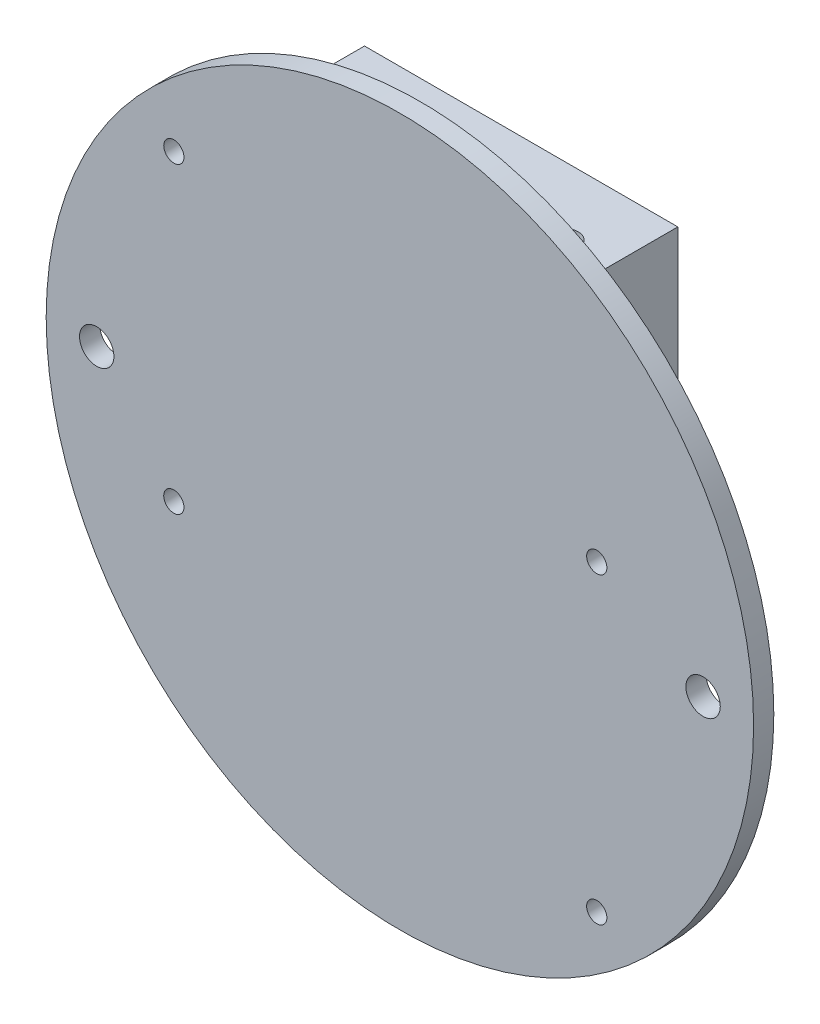
ISO-10303-21;
HEADER;
FILE_DESCRIPTION(('STEP AP214'),'2;1');
FILE_NAME('part.step','',(''),(''),'','','');
FILE_SCHEMA(('AUTOMOTIVE_DESIGN { 1 0 10303 214 1 1 1 1 }'));
ENDSEC;
DATA;
#1=APPLICATION_CONTEXT('core data for automotive mechanical design processes');
#2=APPLICATION_PROTOCOL_DEFINITION('international standard','automotive_design',2000,#1);
#3=PRODUCT_CONTEXT('',#1,'mechanical');
#4=PRODUCT('Part','Part','',(#3));
#5=PRODUCT_RELATED_PRODUCT_CATEGORY('part','',(#4));
#6=PRODUCT_DEFINITION_FORMATION('','',#4);
#7=PRODUCT_DEFINITION_CONTEXT('part definition',#1,'design');
#8=PRODUCT_DEFINITION('design','',#6,#7);
#9=PRODUCT_DEFINITION_SHAPE('','',#8);
#10=(LENGTH_UNIT() NAMED_UNIT(*) SI_UNIT(.MILLI.,.METRE.));
#11=(NAMED_UNIT(*) PLANE_ANGLE_UNIT() SI_UNIT($,.RADIAN.));
#12=(NAMED_UNIT(*) SI_UNIT($,.STERADIAN.) SOLID_ANGLE_UNIT());
#13=UNCERTAINTY_MEASURE_WITH_UNIT(LENGTH_MEASURE(1.E-05),#10,'distance_accuracy_value','');
#14=(GEOMETRIC_REPRESENTATION_CONTEXT(3) GLOBAL_UNCERTAINTY_ASSIGNED_CONTEXT((#13)) GLOBAL_UNIT_ASSIGNED_CONTEXT((#10,
#11,#12)) REPRESENTATION_CONTEXT('',''));
#15=CARTESIAN_POINT('',(0.,0.,0.));
#16=DIRECTION('',(0.,0.,1.));
#17=DIRECTION('',(1.,0.,0.));
#18=AXIS2_PLACEMENT_3D('',#15,#16,#17);
#19=CARTESIAN_POINT('',(0.,0.,0.));
#20=DIRECTION('',(0.,0.,1.));
#21=DIRECTION('',(1.,0.,0.));
#22=AXIS2_PLACEMENT_3D('',#19,#20,#21);
#23=PLANE('',#22);
#24=CARTESIAN_POINT('',(30.,0.,0.));
#25=DIRECTION('',(0.,0.,1.));
#26=DIRECTION('',(1.,0.,0.));
#27=AXIS2_PLACEMENT_3D('',#24,#25,#26);
#28=CIRCLE('',#27,1.7);
#29=CARTESIAN_POINT('',(31.7,0.,0.));
#30=VERTEX_POINT('',#29);
#31=EDGE_CURVE('E215',#30,#30,#28,.T.);
#32=ORIENTED_EDGE('',*,*,#31,.T.);
#33=EDGE_LOOP('',(#32));
#34=FACE_BOUND('',#33,.T.);
#35=CARTESIAN_POINT('',(-30.,0.,0.));
#36=DIRECTION('',(0.,0.,1.));
#37=DIRECTION('',(1.,0.,0.));
#38=AXIS2_PLACEMENT_3D('',#35,#36,#37);
#39=CIRCLE('',#38,1.7);
#40=CARTESIAN_POINT('',(-28.3,0.,0.));
#41=VERTEX_POINT('',#40);
#42=EDGE_CURVE('E525',#41,#41,#39,.T.);
#43=ORIENTED_EDGE('',*,*,#42,.T.);
#44=EDGE_LOOP('',(#43));
#45=FACE_BOUND('',#44,.T.);
#46=CARTESIAN_POINT('',(-22.3667772034413,20.53,0.));
#47=DIRECTION('',(0.,0.,-1.));
#48=DIRECTION('',(-1.,0.,0.));
#49=AXIS2_PLACEMENT_3D('',#46,#47,#48);
#50=CIRCLE('',#49,1.);
#51=CARTESIAN_POINT('',(-23.3667772034413,20.53,0.));
#52=VERTEX_POINT('',#51);
#53=EDGE_CURVE('E187',#52,#52,#50,.T.);
#54=ORIENTED_EDGE('',*,*,#53,.F.);
#55=EDGE_LOOP('',(#54));
#56=FACE_BOUND('',#55,.T.);
#57=CARTESIAN_POINT('',(-22.37,-9.46999982689304,0.));
#58=DIRECTION('',(0.,0.,-1.));
#59=DIRECTION('',(-1.,0.,0.));
#60=AXIS2_PLACEMENT_3D('',#57,#58,#59);
#61=CIRCLE('',#60,1.);
#62=CARTESIAN_POINT('',(-23.37,-9.46999982689304,0.));
#63=VERTEX_POINT('',#62);
#64=EDGE_CURVE('E224',#63,#63,#61,.T.);
#65=ORIENTED_EDGE('',*,*,#64,.F.);
#66=EDGE_LOOP('',(#65));
#67=FACE_BOUND('',#66,.T.);
#68=CARTESIAN_POINT('',(19.48,6.28,0.));
#69=DIRECTION('',(0.,0.,-1.));
#70=DIRECTION('',(-1.,0.,0.));
#71=AXIS2_PLACEMENT_3D('',#68,#69,#70);
#72=CIRCLE('',#71,1.);
#73=CARTESIAN_POINT('',(18.48,6.28,0.));
#74=VERTEX_POINT('',#73);
#75=EDGE_CURVE('E227',#74,#74,#72,.T.);
#76=ORIENTED_EDGE('',*,*,#75,.F.);
#77=EDGE_LOOP('',(#76));
#78=FACE_BOUND('',#77,.T.);
#79=CARTESIAN_POINT('',(19.48,-23.72,0.));
#80=DIRECTION('',(0.,0.,-1.));
#81=DIRECTION('',(-1.,0.,0.));
#82=AXIS2_PLACEMENT_3D('',#79,#80,#81);
#83=CIRCLE('',#82,1.);
#84=CARTESIAN_POINT('',(18.48,-23.72,0.));
#85=VERTEX_POINT('',#84);
#86=EDGE_CURVE('E221',#85,#85,#83,.T.);
#87=ORIENTED_EDGE('',*,*,#86,.F.);
#88=EDGE_LOOP('',(#87));
#89=FACE_BOUND('',#88,.T.);
#90=CARTESIAN_POINT('',(0.,0.,0.));
#91=DIRECTION('',(0.,0.,1.));
#92=DIRECTION('',(1.,0.,0.));
#93=AXIS2_PLACEMENT_3D('',#90,#91,#92);
#94=CIRCLE('',#93,35.);
#95=CARTESIAN_POINT('',(35.,0.,0.));
#96=VERTEX_POINT('',#95);
#97=EDGE_CURVE('E53',#96,#96,#94,.T.);
#98=ORIENTED_EDGE('',*,*,#97,.F.);
#99=EDGE_LOOP('',(#98));
#100=FACE_BOUND('',#99,.T.);
#101=DIRECTION('',(-1.,0.,0.));
#102=VECTOR('',#101,1.);
#103=CARTESIAN_POINT('',(15.5,-9.5,0.));
#104=LINE('',#103,#102);
#105=CARTESIAN_POINT('',(15.5,-9.5,0.));
#106=VERTEX_POINT('',#105);
#107=CARTESIAN_POINT('',(-15.5,-9.49999999999999,0.));
#108=VERTEX_POINT('',#107);
#109=EDGE_CURVE('E128',#106,#108,#104,.T.);
#110=ORIENTED_EDGE('',*,*,#109,.F.);
#111=DIRECTION('',(0.,-1.,0.));
#112=VECTOR('',#111,1.);
#113=CARTESIAN_POINT('',(15.5,27.,0.));
#114=LINE('',#113,#112);
#115=CARTESIAN_POINT('',(15.5,27.,0.));
#116=VERTEX_POINT('',#115);
#117=EDGE_CURVE('E158',#116,#106,#114,.T.);
#118=ORIENTED_EDGE('',*,*,#117,.F.);
#119=DIRECTION('',(1.,0.,0.));
#120=VECTOR('',#119,1.);
#121=CARTESIAN_POINT('',(-15.5,27.,0.));
#122=LINE('',#121,#120);
#123=CARTESIAN_POINT('',(-15.5,27.,0.));
#124=VERTEX_POINT('',#123);
#125=EDGE_CURVE('E66',#124,#116,#122,.T.);
#126=ORIENTED_EDGE('',*,*,#125,.F.);
#127=DIRECTION('',(0.,1.,0.));
#128=VECTOR('',#127,1.);
#129=CARTESIAN_POINT('',(-15.5,-9.49999999999999,0.));
#130=LINE('',#129,#128);
#131=EDGE_CURVE('E61',#108,#124,#130,.T.);
#132=ORIENTED_EDGE('',*,*,#131,.F.);
#133=EDGE_LOOP('',(#110,#118,#126,#132));
#134=FACE_BOUND('',#133,.T.);
#135=ADVANCED_FACE('F44',(#34,#45,#56,#67,#78,#89,#100,#134),#23,.F.);
#136=CARTESIAN_POINT('',(0.,0.,2.));
#137=DIRECTION('',(0.,0.,-1.));
#138=DIRECTION('',(-1.,0.,0.));
#139=AXIS2_PLACEMENT_3D('',#136,#137,#138);
#140=CYLINDRICAL_SURFACE('',#139,35.);
#141=CARTESIAN_POINT('',(0.,0.,2.));
#142=DIRECTION('',(0.,0.,1.));
#143=DIRECTION('',(1.,0.,0.));
#144=AXIS2_PLACEMENT_3D('',#141,#142,#143);
#145=CIRCLE('',#144,35.);
#146=CARTESIAN_POINT('',(35.,0.,2.));
#147=VERTEX_POINT('',#146);
#148=EDGE_CURVE('E11',#147,#147,#145,.T.);
#149=ORIENTED_EDGE('',*,*,#148,.F.);
#150=EDGE_LOOP('',(#149));
#151=FACE_BOUND('',#150,.T.);
#152=ORIENTED_EDGE('',*,*,#97,.T.);
#153=EDGE_LOOP('',(#152));
#154=FACE_BOUND('',#153,.T.);
#155=ADVANCED_FACE('F46',(#151,#154),#140,.T.);
#156=CARTESIAN_POINT('',(0.,0.,2.));
#157=DIRECTION('',(0.,0.,1.));
#158=DIRECTION('',(1.,0.,0.));
#159=AXIS2_PLACEMENT_3D('',#156,#157,#158);
#160=PLANE('',#159);
#161=CARTESIAN_POINT('',(30.,0.,2.));
#162=DIRECTION('',(0.,0.,1.));
#163=DIRECTION('',(1.,0.,0.));
#164=AXIS2_PLACEMENT_3D('',#161,#162,#163);
#165=CIRCLE('',#164,1.7);
#166=CARTESIAN_POINT('',(31.7,0.,2.));
#167=VERTEX_POINT('',#166);
#168=EDGE_CURVE('E522',#167,#167,#165,.T.);
#169=ORIENTED_EDGE('',*,*,#168,.F.);
#170=EDGE_LOOP('',(#169));
#171=FACE_BOUND('',#170,.T.);
#172=CARTESIAN_POINT('',(-30.,0.,2.));
#173=DIRECTION('',(0.,0.,1.));
#174=DIRECTION('',(1.,0.,0.));
#175=AXIS2_PLACEMENT_3D('',#172,#173,#174);
#176=CIRCLE('',#175,1.7);
#177=CARTESIAN_POINT('',(-28.3,0.,2.));
#178=VERTEX_POINT('',#177);
#179=EDGE_CURVE('E529',#178,#178,#176,.T.);
#180=ORIENTED_EDGE('',*,*,#179,.F.);
#181=EDGE_LOOP('',(#180));
#182=FACE_BOUND('',#181,.T.);
#183=CARTESIAN_POINT('',(-22.3667772034413,20.53,2.));
#184=DIRECTION('',(0.,0.,1.));
#185=DIRECTION('',(1.,0.,0.));
#186=AXIS2_PLACEMENT_3D('',#183,#184,#185);
#187=CIRCLE('',#186,1.);
#188=CARTESIAN_POINT('',(-21.3667772034413,20.53,2.));
#189=VERTEX_POINT('',#188);
#190=EDGE_CURVE('E143',#189,#189,#187,.T.);
#191=ORIENTED_EDGE('',*,*,#190,.F.);
#192=EDGE_LOOP('',(#191));
#193=FACE_BOUND('',#192,.T.);
#194=CARTESIAN_POINT('',(-22.37,-9.46999982689304,2.));
#195=DIRECTION('',(0.,0.,1.));
#196=DIRECTION('',(1.,0.,0.));
#197=AXIS2_PLACEMENT_3D('',#194,#195,#196);
#198=CIRCLE('',#197,1.);
#199=CARTESIAN_POINT('',(-21.37,-9.46999982689304,2.));
#200=VERTEX_POINT('',#199);
#201=EDGE_CURVE('E190',#200,#200,#198,.T.);
#202=ORIENTED_EDGE('',*,*,#201,.F.);
#203=EDGE_LOOP('',(#202));
#204=FACE_BOUND('',#203,.T.);
#205=CARTESIAN_POINT('',(19.48,6.28,2.));
#206=DIRECTION('',(0.,0.,1.));
#207=DIRECTION('',(1.,0.,0.));
#208=AXIS2_PLACEMENT_3D('',#205,#206,#207);
#209=CIRCLE('',#208,1.);
#210=CARTESIAN_POINT('',(20.48,6.28,2.));
#211=VERTEX_POINT('',#210);
#212=EDGE_CURVE('E186',#211,#211,#209,.T.);
#213=ORIENTED_EDGE('',*,*,#212,.F.);
#214=EDGE_LOOP('',(#213));
#215=FACE_BOUND('',#214,.T.);
#216=CARTESIAN_POINT('',(19.48,-23.72,2.));
#217=DIRECTION('',(0.,0.,1.));
#218=DIRECTION('',(1.,0.,0.));
#219=AXIS2_PLACEMENT_3D('',#216,#217,#218);
#220=CIRCLE('',#219,1.);
#221=CARTESIAN_POINT('',(20.48,-23.72,2.));
#222=VERTEX_POINT('',#221);
#223=EDGE_CURVE('E183',#222,#222,#220,.T.);
#224=ORIENTED_EDGE('',*,*,#223,.F.);
#225=EDGE_LOOP('',(#224));
#226=FACE_BOUND('',#225,.T.);
#227=ORIENTED_EDGE('',*,*,#148,.T.);
#228=EDGE_LOOP('',(#227));
#229=FACE_BOUND('',#228,.T.);
#230=ADVANCED_FACE('F267',(#171,#182,#193,#204,#215,#226,#229),#160,.T.);
#231=CARTESIAN_POINT('',(0.,0.,-10.));
#232=DIRECTION('',(0.,0.,-1.));
#233=DIRECTION('',(-1.,0.,0.));
#234=AXIS2_PLACEMENT_3D('',#231,#232,#233);
#235=PLANE('',#234);
#236=DIRECTION('',(-1.,0.,0.));
#237=VECTOR('',#236,1.);
#238=CARTESIAN_POINT('',(15.5,-9.5,-10.));
#239=LINE('',#238,#237);
#240=CARTESIAN_POINT('',(15.5,-9.5,-10.));
#241=VERTEX_POINT('',#240);
#242=CARTESIAN_POINT('',(-15.5,-9.49999999999999,-10.));
#243=VERTEX_POINT('',#242);
#244=EDGE_CURVE('E154',#241,#243,#239,.T.);
#245=ORIENTED_EDGE('',*,*,#244,.T.);
#246=DIRECTION('',(0.,1.,0.));
#247=VECTOR('',#246,1.);
#248=CARTESIAN_POINT('',(-15.5,-9.49999999999999,-10.));
#249=LINE('',#248,#247);
#250=CARTESIAN_POINT('',(-15.5,27.,-10.));
#251=VERTEX_POINT('',#250);
#252=EDGE_CURVE('E157',#243,#251,#249,.T.);
#253=ORIENTED_EDGE('',*,*,#252,.T.);
#254=DIRECTION('',(1.,0.,0.));
#255=VECTOR('',#254,1.);
#256=CARTESIAN_POINT('',(-15.5,27.,-10.));
#257=LINE('',#256,#255);
#258=CARTESIAN_POINT('',(15.5,27.,-10.));
#259=VERTEX_POINT('',#258);
#260=EDGE_CURVE('E160',#251,#259,#257,.T.);
#261=ORIENTED_EDGE('',*,*,#260,.T.);
#262=DIRECTION('',(0.,-1.,0.));
#263=VECTOR('',#262,1.);
#264=CARTESIAN_POINT('',(15.5,27.,-10.));
#265=LINE('',#264,#263);
#266=EDGE_CURVE('E162',#259,#241,#265,.T.);
#267=ORIENTED_EDGE('',*,*,#266,.T.);
#268=EDGE_LOOP('',(#245,#253,#261,#267));
#269=FACE_BOUND('',#268,.T.);
#270=DIRECTION('',(0.,1.,0.));
#271=VECTOR('',#270,1.);
#272=CARTESIAN_POINT('',(-14.5,-8.5,-10.));
#273=LINE('',#272,#271);
#274=CARTESIAN_POINT('',(-14.5,-8.5,-10.));
#275=VERTEX_POINT('',#274);
#276=CARTESIAN_POINT('',(-14.5,26.,-10.));
#277=VERTEX_POINT('',#276);
#278=EDGE_CURVE('E120',#275,#277,#273,.T.);
#279=ORIENTED_EDGE('',*,*,#278,.F.);
#280=DIRECTION('',(-1.,0.,0.));
#281=VECTOR('',#280,1.);
#282=CARTESIAN_POINT('',(14.5,-8.5,-10.));
#283=LINE('',#282,#281);
#284=CARTESIAN_POINT('',(14.5,-8.5,-10.));
#285=VERTEX_POINT('',#284);
#286=EDGE_CURVE('E110',#285,#275,#283,.T.);
#287=ORIENTED_EDGE('',*,*,#286,.F.);
#288=DIRECTION('',(0.,-1.,0.));
#289=VECTOR('',#288,1.);
#290=CARTESIAN_POINT('',(14.5,26.,-10.));
#291=LINE('',#290,#289);
#292=CARTESIAN_POINT('',(14.5,26.,-10.));
#293=VERTEX_POINT('',#292);
#294=EDGE_CURVE('E136',#293,#285,#291,.T.);
#295=ORIENTED_EDGE('',*,*,#294,.F.);
#296=DIRECTION('',(1.,0.,0.));
#297=VECTOR('',#296,1.);
#298=CARTESIAN_POINT('',(-14.5,26.,-10.));
#299=LINE('',#298,#297);
#300=EDGE_CURVE('E134',#277,#293,#299,.T.);
#301=ORIENTED_EDGE('',*,*,#300,.F.);
#302=EDGE_LOOP('',(#279,#287,#295,#301));
#303=FACE_BOUND('',#302,.T.);
#304=ADVANCED_FACE('F132',(#269,#303),#235,.T.);
#305=CARTESIAN_POINT('',(15.5,-9.5,-10.));
#306=DIRECTION('',(0.,1.,0.));
#307=DIRECTION('',(-1.,0.,0.));
#308=AXIS2_PLACEMENT_3D('',#305,#306,#307);
#309=PLANE('',#308);
#310=CARTESIAN_POINT('',(-11.,-9.49999999999999,-3.25));
#311=DIRECTION('',(0.,1.,0.));
#312=DIRECTION('',(-1.,0.,0.));
#313=AXIS2_PLACEMENT_3D('',#310,#311,#312);
#314=CIRCLE('',#313,1.4);
#315=CARTESIAN_POINT('',(-12.4,-9.49999999999999,-3.25));
#316=VERTEX_POINT('',#315);
#317=EDGE_CURVE('E197',#316,#316,#314,.F.);
#318=ORIENTED_EDGE('',*,*,#317,.F.);
#319=EDGE_LOOP('',(#318));
#320=FACE_BOUND('',#319,.T.);
#321=CARTESIAN_POINT('',(11.,-9.5,-3.25));
#322=DIRECTION('',(0.,1.,0.));
#323=DIRECTION('',(-1.,0.,0.));
#324=AXIS2_PLACEMENT_3D('',#321,#322,#323);
#325=CIRCLE('',#324,1.4);
#326=CARTESIAN_POINT('',(9.6,-9.5,-3.25));
#327=VERTEX_POINT('',#326);
#328=EDGE_CURVE('E208',#327,#327,#325,.F.);
#329=ORIENTED_EDGE('',*,*,#328,.F.);
#330=EDGE_LOOP('',(#329));
#331=FACE_BOUND('',#330,.T.);
#332=ORIENTED_EDGE('',*,*,#109,.T.);
#333=DIRECTION('',(0.,0.,1.));
#334=VECTOR('',#333,1.);
#335=CARTESIAN_POINT('',(-15.5,-9.49999999999999,-10.));
#336=LINE('',#335,#334);
#337=EDGE_CURVE('E179',#243,#108,#336,.T.);
#338=ORIENTED_EDGE('',*,*,#337,.F.);
#339=ORIENTED_EDGE('',*,*,#244,.F.);
#340=DIRECTION('',(0.,0.,1.));
#341=VECTOR('',#340,1.);
#342=CARTESIAN_POINT('',(15.5,-9.5,-10.));
#343=LINE('',#342,#341);
#344=EDGE_CURVE('E164',#241,#106,#343,.T.);
#345=ORIENTED_EDGE('',*,*,#344,.T.);
#346=EDGE_LOOP('',(#332,#338,#339,#345));
#347=FACE_BOUND('',#346,.T.);
#348=ADVANCED_FACE('F247',(#320,#331,#347),#309,.F.);
#349=CARTESIAN_POINT('',(-15.5,-9.49999999999999,-10.));
#350=DIRECTION('',(1.,0.,0.));
#351=DIRECTION('',(0.,1.,0.));
#352=AXIS2_PLACEMENT_3D('',#349,#350,#351);
#353=PLANE('',#352);
#354=ORIENTED_EDGE('',*,*,#131,.T.);
#355=DIRECTION('',(0.,0.,1.));
#356=VECTOR('',#355,1.);
#357=CARTESIAN_POINT('',(-15.5,27.,-10.));
#358=LINE('',#357,#356);
#359=EDGE_CURVE('E176',#251,#124,#358,.T.);
#360=ORIENTED_EDGE('',*,*,#359,.F.);
#361=ORIENTED_EDGE('',*,*,#252,.F.);
#362=ORIENTED_EDGE('',*,*,#337,.T.);
#363=EDGE_LOOP('',(#354,#360,#361,#362));
#364=FACE_BOUND('',#363,.T.);
#365=ADVANCED_FACE('F254',(#364),#353,.F.);
#366=CARTESIAN_POINT('',(-15.5,27.,-10.));
#367=DIRECTION('',(0.,-1.,0.));
#368=DIRECTION('',(1.,0.,0.));
#369=AXIS2_PLACEMENT_3D('',#366,#367,#368);
#370=PLANE('',#369);
#371=CARTESIAN_POINT('',(-11.,27.,-3.25));
#372=DIRECTION('',(0.,-1.,0.));
#373=DIRECTION('',(1.,0.,0.));
#374=AXIS2_PLACEMENT_3D('',#371,#372,#373);
#375=CIRCLE('',#374,1.4);
#376=CARTESIAN_POINT('',(-9.6,27.,-3.25));
#377=VERTEX_POINT('',#376);
#378=EDGE_CURVE('E203',#377,#377,#375,.T.);
#379=ORIENTED_EDGE('',*,*,#378,.T.);
#380=EDGE_LOOP('',(#379));
#381=FACE_BOUND('',#380,.T.);
#382=CARTESIAN_POINT('',(11.,27.,-3.25));
#383=DIRECTION('',(0.,-1.,0.));
#384=DIRECTION('',(1.,0.,0.));
#385=AXIS2_PLACEMENT_3D('',#382,#383,#384);
#386=CIRCLE('',#385,1.4);
#387=CARTESIAN_POINT('',(12.4,27.,-3.25));
#388=VERTEX_POINT('',#387);
#389=EDGE_CURVE('E212',#388,#388,#386,.T.);
#390=ORIENTED_EDGE('',*,*,#389,.T.);
#391=EDGE_LOOP('',(#390));
#392=FACE_BOUND('',#391,.T.);
#393=ORIENTED_EDGE('',*,*,#125,.T.);
#394=DIRECTION('',(0.,0.,1.));
#395=VECTOR('',#394,1.);
#396=CARTESIAN_POINT('',(15.5,27.,-10.));
#397=LINE('',#396,#395);
#398=EDGE_CURVE('E173',#259,#116,#397,.T.);
#399=ORIENTED_EDGE('',*,*,#398,.F.);
#400=ORIENTED_EDGE('',*,*,#260,.F.);
#401=ORIENTED_EDGE('',*,*,#359,.T.);
#402=EDGE_LOOP('',(#393,#399,#400,#401));
#403=FACE_BOUND('',#402,.T.);
#404=ADVANCED_FACE('F252',(#381,#392,#403),#370,.F.);
#405=CARTESIAN_POINT('',(15.5,27.,-10.));
#406=DIRECTION('',(-1.,0.,0.));
#407=DIRECTION('',(0.,-1.,0.));
#408=AXIS2_PLACEMENT_3D('',#405,#406,#407);
#409=PLANE('',#408);
#410=ORIENTED_EDGE('',*,*,#117,.T.);
#411=ORIENTED_EDGE('',*,*,#344,.F.);
#412=ORIENTED_EDGE('',*,*,#266,.F.);
#413=ORIENTED_EDGE('',*,*,#398,.T.);
#414=EDGE_LOOP('',(#410,#411,#412,#413));
#415=FACE_BOUND('',#414,.T.);
#416=ADVANCED_FACE('F243',(#415),#409,.F.);
#417=CARTESIAN_POINT('',(14.5,-8.5,-10.));
#418=DIRECTION('',(0.,1.,0.));
#419=DIRECTION('',(-1.,0.,0.));
#420=AXIS2_PLACEMENT_3D('',#417,#418,#419);
#421=PLANE('',#420);
#422=CARTESIAN_POINT('',(-11.,-8.5,-3.25));
#423=DIRECTION('',(0.,1.,0.));
#424=DIRECTION('',(-1.,0.,0.));
#425=AXIS2_PLACEMENT_3D('',#422,#423,#424);
#426=CIRCLE('',#425,1.4);
#427=CARTESIAN_POINT('',(-12.4,-8.5,-3.25));
#428=VERTEX_POINT('',#427);
#429=EDGE_CURVE('E218',#428,#428,#426,.T.);
#430=ORIENTED_EDGE('',*,*,#429,.F.);
#431=EDGE_LOOP('',(#430));
#432=FACE_BOUND('',#431,.T.);
#433=CARTESIAN_POINT('',(11.,-8.5,-3.25));
#434=DIRECTION('',(0.,1.,0.));
#435=DIRECTION('',(-1.,0.,0.));
#436=AXIS2_PLACEMENT_3D('',#433,#434,#435);
#437=CIRCLE('',#436,1.4);
#438=CARTESIAN_POINT('',(9.6,-8.5,-3.25));
#439=VERTEX_POINT('',#438);
#440=EDGE_CURVE('E196',#439,#439,#437,.T.);
#441=ORIENTED_EDGE('',*,*,#440,.F.);
#442=EDGE_LOOP('',(#441));
#443=FACE_BOUND('',#442,.T.);
#444=DIRECTION('',(-1.,0.,0.));
#445=VECTOR('',#444,1.);
#446=CARTESIAN_POINT('',(14.5,-8.5,0.));
#447=LINE('',#446,#445);
#448=CARTESIAN_POINT('',(14.5,-8.5,0.));
#449=VERTEX_POINT('',#448);
#450=CARTESIAN_POINT('',(-14.5,-8.5,0.));
#451=VERTEX_POINT('',#450);
#452=EDGE_CURVE('E141',#449,#451,#447,.T.);
#453=ORIENTED_EDGE('',*,*,#452,.F.);
#454=DIRECTION('',(0.,0.,1.));
#455=VECTOR('',#454,1.);
#456=CARTESIAN_POINT('',(14.5,-8.5,-10.));
#457=LINE('',#456,#455);
#458=EDGE_CURVE('E116',#285,#449,#457,.T.);
#459=ORIENTED_EDGE('',*,*,#458,.F.);
#460=ORIENTED_EDGE('',*,*,#286,.T.);
#461=DIRECTION('',(0.,0.,1.));
#462=VECTOR('',#461,1.);
#463=CARTESIAN_POINT('',(-14.5,-8.5,-10.));
#464=LINE('',#463,#462);
#465=EDGE_CURVE('E114',#275,#451,#464,.T.);
#466=ORIENTED_EDGE('',*,*,#465,.T.);
#467=EDGE_LOOP('',(#453,#459,#460,#466));
#468=FACE_BOUND('',#467,.T.);
#469=ADVANCED_FACE('F113',(#432,#443,#468),#421,.T.);
#470=CARTESIAN_POINT('',(-14.5,-8.5,-10.));
#471=DIRECTION('',(1.,0.,0.));
#472=DIRECTION('',(0.,0.,-1.));
#473=AXIS2_PLACEMENT_3D('',#470,#471,#472);
#474=PLANE('',#473);
#475=DIRECTION('',(0.,1.,0.));
#476=VECTOR('',#475,1.);
#477=CARTESIAN_POINT('',(-14.5,-8.5,0.));
#478=LINE('',#477,#476);
#479=CARTESIAN_POINT('',(-14.5,26.,0.));
#480=VERTEX_POINT('',#479);
#481=EDGE_CURVE('E127',#451,#480,#478,.T.);
#482=ORIENTED_EDGE('',*,*,#481,.F.);
#483=ORIENTED_EDGE('',*,*,#465,.F.);
#484=ORIENTED_EDGE('',*,*,#278,.T.);
#485=DIRECTION('',(0.,0.,1.));
#486=VECTOR('',#485,1.);
#487=CARTESIAN_POINT('',(-14.5,26.,-10.));
#488=LINE('',#487,#486);
#489=EDGE_CURVE('E129',#277,#480,#488,.T.);
#490=ORIENTED_EDGE('',*,*,#489,.T.);
#491=EDGE_LOOP('',(#482,#483,#484,#490));
#492=FACE_BOUND('',#491,.T.);
#493=ADVANCED_FACE('F124',(#492),#474,.T.);
#494=CARTESIAN_POINT('',(-14.5,26.,-10.));
#495=DIRECTION('',(0.,-1.,0.));
#496=DIRECTION('',(1.,0.,0.));
#497=AXIS2_PLACEMENT_3D('',#494,#495,#496);
#498=PLANE('',#497);
#499=CARTESIAN_POINT('',(-11.,26.,-3.25));
#500=DIRECTION('',(0.,-1.,0.));
#501=DIRECTION('',(1.,0.,0.));
#502=AXIS2_PLACEMENT_3D('',#499,#500,#501);
#503=CIRCLE('',#502,1.4);
#504=CARTESIAN_POINT('',(-9.6,26.,-3.25));
#505=VERTEX_POINT('',#504);
#506=EDGE_CURVE('E48',#505,#505,#503,.T.);
#507=ORIENTED_EDGE('',*,*,#506,.F.);
#508=EDGE_LOOP('',(#507));
#509=FACE_BOUND('',#508,.T.);
#510=CARTESIAN_POINT('',(11.,26.,-3.25));
#511=DIRECTION('',(0.,-1.,0.));
#512=DIRECTION('',(1.,0.,0.));
#513=AXIS2_PLACEMENT_3D('',#510,#511,#512);
#514=CIRCLE('',#513,1.4);
#515=CARTESIAN_POINT('',(12.4,26.,-3.25));
#516=VERTEX_POINT('',#515);
#517=EDGE_CURVE('E194',#516,#516,#514,.T.);
#518=ORIENTED_EDGE('',*,*,#517,.F.);
#519=EDGE_LOOP('',(#518));
#520=FACE_BOUND('',#519,.T.);
#521=DIRECTION('',(1.,0.,0.));
#522=VECTOR('',#521,1.);
#523=CARTESIAN_POINT('',(-14.5,26.,0.));
#524=LINE('',#523,#522);
#525=CARTESIAN_POINT('',(14.5,26.,0.));
#526=VERTEX_POINT('',#525);
#527=EDGE_CURVE('E145',#480,#526,#524,.T.);
#528=ORIENTED_EDGE('',*,*,#527,.F.);
#529=ORIENTED_EDGE('',*,*,#489,.F.);
#530=ORIENTED_EDGE('',*,*,#300,.T.);
#531=DIRECTION('',(0.,0.,1.));
#532=VECTOR('',#531,1.);
#533=CARTESIAN_POINT('',(14.5,26.,-10.));
#534=LINE('',#533,#532);
#535=EDGE_CURVE('E151',#293,#526,#534,.T.);
#536=ORIENTED_EDGE('',*,*,#535,.T.);
#537=EDGE_LOOP('',(#528,#529,#530,#536));
#538=FACE_BOUND('',#537,.T.);
#539=ADVANCED_FACE('F280',(#509,#520,#538),#498,.T.);
#540=CARTESIAN_POINT('',(14.5,26.,-10.));
#541=DIRECTION('',(-1.,0.,0.));
#542=DIRECTION('',(0.,-1.,0.));
#543=AXIS2_PLACEMENT_3D('',#540,#541,#542);
#544=PLANE('',#543);
#545=DIRECTION('',(0.,-1.,0.));
#546=VECTOR('',#545,1.);
#547=CARTESIAN_POINT('',(14.5,26.,0.));
#548=LINE('',#547,#546);
#549=EDGE_CURVE('E121',#526,#449,#548,.T.);
#550=ORIENTED_EDGE('',*,*,#549,.F.);
#551=ORIENTED_EDGE('',*,*,#535,.F.);
#552=ORIENTED_EDGE('',*,*,#294,.T.);
#553=ORIENTED_EDGE('',*,*,#458,.T.);
#554=EDGE_LOOP('',(#550,#551,#552,#553));
#555=FACE_BOUND('',#554,.T.);
#556=ADVANCED_FACE('F271',(#555),#544,.T.);
#557=ORIENTED_EDGE('',*,*,#549,.T.);
#558=ORIENTED_EDGE('',*,*,#452,.T.);
#559=ORIENTED_EDGE('',*,*,#481,.T.);
#560=ORIENTED_EDGE('',*,*,#527,.T.);
#561=EDGE_LOOP('',(#557,#558,#559,#560));
#562=FACE_BOUND('',#561,.T.);
#563=ADVANCED_FACE('F237',(#562),#23,.F.);
#564=CARTESIAN_POINT('',(19.48,-23.72,10.));
#565=DIRECTION('',(0.,0.,-1.));
#566=DIRECTION('',(-1.,0.,0.));
#567=AXIS2_PLACEMENT_3D('',#564,#565,#566);
#568=CYLINDRICAL_SURFACE('',#567,1.);
#569=ORIENTED_EDGE('',*,*,#223,.T.);
#570=EDGE_LOOP('',(#569));
#571=FACE_BOUND('',#570,.T.);
#572=ORIENTED_EDGE('',*,*,#86,.T.);
#573=EDGE_LOOP('',(#572));
#574=FACE_BOUND('',#573,.T.);
#575=ADVANCED_FACE('F232',(#571,#574),#568,.F.);
#576=CARTESIAN_POINT('',(19.48,6.28,10.));
#577=DIRECTION('',(0.,0.,-1.));
#578=DIRECTION('',(-1.,0.,0.));
#579=AXIS2_PLACEMENT_3D('',#576,#577,#578);
#580=CYLINDRICAL_SURFACE('',#579,1.);
#581=ORIENTED_EDGE('',*,*,#212,.T.);
#582=EDGE_LOOP('',(#581));
#583=FACE_BOUND('',#582,.T.);
#584=ORIENTED_EDGE('',*,*,#75,.T.);
#585=EDGE_LOOP('',(#584));
#586=FACE_BOUND('',#585,.T.);
#587=ADVANCED_FACE('F277',(#583,#586),#580,.F.);
#588=CARTESIAN_POINT('',(-22.37,-9.46999982689304,10.));
#589=DIRECTION('',(0.,0.,-1.));
#590=DIRECTION('',(-1.,0.,0.));
#591=AXIS2_PLACEMENT_3D('',#588,#589,#590);
#592=CYLINDRICAL_SURFACE('',#591,1.);
#593=ORIENTED_EDGE('',*,*,#201,.T.);
#594=EDGE_LOOP('',(#593));
#595=FACE_BOUND('',#594,.T.);
#596=ORIENTED_EDGE('',*,*,#64,.T.);
#597=EDGE_LOOP('',(#596));
#598=FACE_BOUND('',#597,.T.);
#599=ADVANCED_FACE('F343',(#595,#598),#592,.F.);
#600=CARTESIAN_POINT('',(-22.3667772034413,20.53,10.));
#601=DIRECTION('',(0.,0.,-1.));
#602=DIRECTION('',(-1.,0.,0.));
#603=AXIS2_PLACEMENT_3D('',#600,#601,#602);
#604=CYLINDRICAL_SURFACE('',#603,1.);
#605=ORIENTED_EDGE('',*,*,#190,.T.);
#606=EDGE_LOOP('',(#605));
#607=FACE_BOUND('',#606,.T.);
#608=ORIENTED_EDGE('',*,*,#53,.T.);
#609=EDGE_LOOP('',(#608));
#610=FACE_BOUND('',#609,.T.);
#611=ADVANCED_FACE('F353',(#607,#610),#604,.F.);
#612=CARTESIAN_POINT('',(11.,-13.4597979746447,-3.25));
#613=DIRECTION('',(0.,1.,0.));
#614=DIRECTION('',(-1.,0.,0.));
#615=AXIS2_PLACEMENT_3D('',#612,#613,#614);
#616=CYLINDRICAL_SURFACE('',#615,1.4);
#617=ORIENTED_EDGE('',*,*,#517,.T.);
#618=EDGE_LOOP('',(#617));
#619=FACE_BOUND('',#618,.T.);
#620=ORIENTED_EDGE('',*,*,#389,.F.);
#621=EDGE_LOOP('',(#620));
#622=FACE_BOUND('',#621,.T.);
#623=ADVANCED_FACE('F363',(#619,#622),#616,.F.);
#624=CARTESIAN_POINT('',(-11.,-13.4597979746447,-3.25));
#625=DIRECTION('',(0.,1.,0.));
#626=DIRECTION('',(-1.,0.,0.));
#627=AXIS2_PLACEMENT_3D('',#624,#625,#626);
#628=CYLINDRICAL_SURFACE('',#627,1.4);
#629=ORIENTED_EDGE('',*,*,#506,.T.);
#630=EDGE_LOOP('',(#629));
#631=FACE_BOUND('',#630,.T.);
#632=ORIENTED_EDGE('',*,*,#378,.F.);
#633=EDGE_LOOP('',(#632));
#634=FACE_BOUND('',#633,.T.);
#635=ADVANCED_FACE('F373',(#631,#634),#628,.F.);
#636=ORIENTED_EDGE('',*,*,#440,.T.);
#637=EDGE_LOOP('',(#636));
#638=FACE_BOUND('',#637,.T.);
#639=ORIENTED_EDGE('',*,*,#328,.T.);
#640=EDGE_LOOP('',(#639));
#641=FACE_BOUND('',#640,.T.);
#642=ADVANCED_FACE('F375',(#638,#641),#616,.F.);
#643=ORIENTED_EDGE('',*,*,#429,.T.);
#644=EDGE_LOOP('',(#643));
#645=FACE_BOUND('',#644,.T.);
#646=ORIENTED_EDGE('',*,*,#317,.T.);
#647=EDGE_LOOP('',(#646));
#648=FACE_BOUND('',#647,.T.);
#649=ADVANCED_FACE('F385',(#645,#648),#628,.F.);
#650=CARTESIAN_POINT('',(-30.,0.,-10.));
#651=DIRECTION('',(0.,0.,1.));
#652=DIRECTION('',(1.,0.,0.));
#653=AXIS2_PLACEMENT_3D('',#650,#651,#652);
#654=CYLINDRICAL_SURFACE('',#653,1.7);
#655=ORIENTED_EDGE('',*,*,#179,.T.);
#656=EDGE_LOOP('',(#655));
#657=FACE_BOUND('',#656,.T.);
#658=ORIENTED_EDGE('',*,*,#42,.F.);
#659=EDGE_LOOP('',(#658));
#660=FACE_BOUND('',#659,.T.);
#661=ADVANCED_FACE('F401',(#657,#660),#654,.F.);
#662=CARTESIAN_POINT('',(30.,0.,-10.));
#663=DIRECTION('',(0.,0.,1.));
#664=DIRECTION('',(1.,0.,0.));
#665=AXIS2_PLACEMENT_3D('',#662,#663,#664);
#666=CYLINDRICAL_SURFACE('',#665,1.7);
#667=ORIENTED_EDGE('',*,*,#168,.T.);
#668=EDGE_LOOP('',(#667));
#669=FACE_BOUND('',#668,.T.);
#670=ORIENTED_EDGE('',*,*,#31,.F.);
#671=EDGE_LOOP('',(#670));
#672=FACE_BOUND('',#671,.T.);
#673=ADVANCED_FACE('F411',(#669,#672),#666,.F.);
#674=CLOSED_SHELL('',(#135,#155,#230,#304,#348,#365,#404,#416,#469,#493,#539,#556,#563,#575,
#587,#599,#611,#623,#635,#642,#649,#661,#673));
#675=MANIFOLD_SOLID_BREP('B2',#674);
#676=ADVANCED_BREP_SHAPE_REPRESENTATION('',(#18,#675),#14);
#677=SHAPE_DEFINITION_REPRESENTATION(#9,#676);
ENDSEC;
END-ISO-10303-21;
